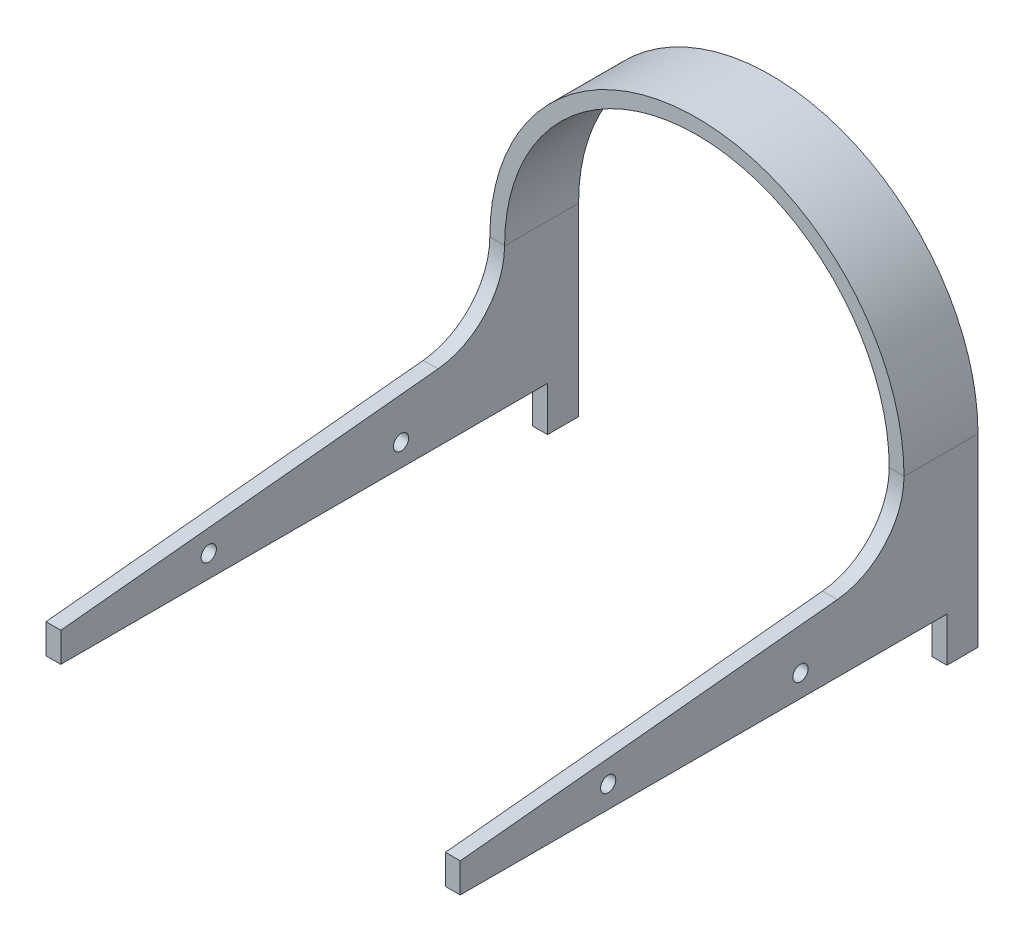
ISO-10303-21;
HEADER;
FILE_DESCRIPTION(('STEP AP214'),'2;1');
FILE_NAME('part.step','',(''),(''),'','','');
FILE_SCHEMA(('AUTOMOTIVE_DESIGN { 1 0 10303 214 1 1 1 1 }'));
ENDSEC;
DATA;
#1=APPLICATION_CONTEXT('core data for automotive mechanical design processes');
#2=APPLICATION_PROTOCOL_DEFINITION('international standard','automotive_design',2000,#1);
#3=PRODUCT_CONTEXT('',#1,'mechanical');
#4=PRODUCT('Part','Part','',(#3));
#5=PRODUCT_RELATED_PRODUCT_CATEGORY('part','',(#4));
#6=PRODUCT_DEFINITION_FORMATION('','',#4);
#7=PRODUCT_DEFINITION_CONTEXT('part definition',#1,'design');
#8=PRODUCT_DEFINITION('design','',#6,#7);
#9=PRODUCT_DEFINITION_SHAPE('','',#8);
#10=(LENGTH_UNIT() NAMED_UNIT(*) SI_UNIT(.MILLI.,.METRE.));
#11=(NAMED_UNIT(*) PLANE_ANGLE_UNIT() SI_UNIT($,.RADIAN.));
#12=(NAMED_UNIT(*) SI_UNIT($,.STERADIAN.) SOLID_ANGLE_UNIT());
#13=UNCERTAINTY_MEASURE_WITH_UNIT(LENGTH_MEASURE(1.E-05),#10,'distance_accuracy_value','');
#14=(GEOMETRIC_REPRESENTATION_CONTEXT(3) GLOBAL_UNCERTAINTY_ASSIGNED_CONTEXT((#13)) GLOBAL_UNIT_ASSIGNED_CONTEXT((#10,
#11,#12)) REPRESENTATION_CONTEXT('',''));
#15=CARTESIAN_POINT('',(0.,0.,0.));
#16=DIRECTION('',(0.,0.,1.));
#17=DIRECTION('',(1.,0.,0.));
#18=AXIS2_PLACEMENT_3D('',#15,#16,#17);
#19=CARTESIAN_POINT('',(0.,0.,350.));
#20=DIRECTION('',(0.,0.,1.));
#21=DIRECTION('',(1.,0.,0.));
#22=AXIS2_PLACEMENT_3D('',#19,#20,#21);
#23=PLANE('',#22);
#24=DIRECTION('',(1.,0.,0.));
#25=VECTOR('',#24,1.);
#26=CARTESIAN_POINT('',(0.,-75.,350.));
#27=LINE('',#26,#25);
#28=CARTESIAN_POINT('',(-140.,-75.,350.));
#29=VERTEX_POINT('',#28);
#30=CARTESIAN_POINT('',(-130.,-75.,350.));
#31=VERTEX_POINT('',#30);
#32=EDGE_CURVE('E44',#29,#31,#27,.T.);
#33=ORIENTED_EDGE('',*,*,#32,.F.);
#34=DIRECTION('',(0.,-1.,0.));
#35=VECTOR('',#34,1.);
#36=CARTESIAN_POINT('',(-140.,0.,350.));
#37=LINE('',#36,#35);
#38=CARTESIAN_POINT('',(-140.,-95.,350.));
#39=VERTEX_POINT('',#38);
#40=EDGE_CURVE('E282',#29,#39,#37,.T.);
#41=ORIENTED_EDGE('',*,*,#40,.T.);
#42=DIRECTION('',(-1.,0.,0.));
#43=VECTOR('',#42,1.);
#44=CARTESIAN_POINT('',(0.,-95.,350.));
#45=LINE('',#44,#43);
#46=CARTESIAN_POINT('',(-130.,-95.,350.));
#47=VERTEX_POINT('',#46);
#48=EDGE_CURVE('E328',#47,#39,#45,.T.);
#49=ORIENTED_EDGE('',*,*,#48,.F.);
#50=DIRECTION('',(0.,1.,0.));
#51=VECTOR('',#50,1.);
#52=CARTESIAN_POINT('',(-130.,-125.,350.));
#53=LINE('',#52,#51);
#54=EDGE_CURVE('E284',#47,#31,#53,.T.);
#55=ORIENTED_EDGE('',*,*,#54,.T.);
#56=EDGE_LOOP('',(#33,#41,#49,#55));
#57=FACE_BOUND('',#56,.T.);
#58=ADVANCED_FACE('F35',(#57),#23,.T.);
#59=CARTESIAN_POINT('',(0.,0.,350.));
#60=DIRECTION('',(0.,0.,-1.));
#61=DIRECTION('',(-1.,0.,0.));
#62=AXIS2_PLACEMENT_3D('',#59,#60,#61);
#63=CYLINDRICAL_SURFACE('',#62,140.);
#64=DIRECTION('',(0.,0.,-1.));
#65=VECTOR('',#64,1.);
#66=CARTESIAN_POINT('',(-140.,0.,350.));
#67=LINE('',#66,#65);
#68=CARTESIAN_POINT('',(-140.,0.,50.0006218982631));
#69=VERTEX_POINT('',#68);
#70=CARTESIAN_POINT('',(-140.,0.,0.));
#71=VERTEX_POINT('',#70);
#72=EDGE_CURVE('E326',#69,#71,#67,.T.);
#73=ORIENTED_EDGE('',*,*,#72,.F.);
#74=CARTESIAN_POINT('',(-140.,0.,50.0006218982631));
#75=CARTESIAN_POINT('',(-140.000000000223,0.0415627920890886,50.000414598921));
#76=CARTESIAN_POINT('',(-139.999981491558,0.0831256969340281,50.0002591243947));
#77=CARTESIAN_POINT('',(-139.999907456452,0.166251732135609,50.0000518249737));
#78=CARTESIAN_POINT('',(-139.999851930011,0.207814862492251,50.000000000079));
#79=CARTESIAN_POINT('',(-139.999777894683,0.249378105604743,50.));
#80=B_SPLINE_CURVE_WITH_KNOTS('',3,(#74,#75,#76,#77,#78,#79),.UNSPECIFIED.,.F.,.F.,(4,2,4),(0.,
0.124689599271297,0.249379198542594),.UNSPECIFIED.);
#81=CARTESIAN_POINT('',(-139.999777894683,0.249378105604721,50.));
#82=VERTEX_POINT('',#81);
#83=EDGE_CURVE('E241',#69,#82,#80,.T.);
#84=ORIENTED_EDGE('',*,*,#83,.T.);
#85=CARTESIAN_POINT('',(0.,0.,50.));
#86=DIRECTION('',(0.,0.,-1.));
#87=DIRECTION('',(0.,1.,0.));
#88=AXIS2_PLACEMENT_3D('',#85,#86,#87);
#89=CIRCLE('',#88,140.);
#90=CARTESIAN_POINT('',(139.999777894683,0.249378105604846,50.));
#91=VERTEX_POINT('',#90);
#92=EDGE_CURVE('E248',#82,#91,#89,.T.);
#93=ORIENTED_EDGE('',*,*,#92,.T.);
#94=CARTESIAN_POINT('',(139.999777894683,0.249378105604867,50.));
#95=CARTESIAN_POINT('',(139.999851930011,0.207814862492357,50.000000000079));
#96=CARTESIAN_POINT('',(139.999907456452,0.166251732135698,50.0000518249737));
#97=CARTESIAN_POINT('',(139.999981491558,0.083125696934081,50.0002591243947));
#98=CARTESIAN_POINT('',(140.000000000223,0.0415627920891236,50.000414598921));
#99=CARTESIAN_POINT('',(140.,0.,50.0006218982631));
#100=B_SPLINE_CURVE_WITH_KNOTS('',3,(#94,#95,#96,#97,#98,#99),.UNSPECIFIED.,.F.,.F.,(4,2,4),(0.,
0.12468959927135,0.249379198542701),.UNSPECIFIED.);
#101=CARTESIAN_POINT('',(140.,0.,50.0006218982631));
#102=VERTEX_POINT('',#101);
#103=EDGE_CURVE('E237',#91,#102,#100,.T.);
#104=ORIENTED_EDGE('',*,*,#103,.T.);
#105=DIRECTION('',(0.,0.,-1.));
#106=VECTOR('',#105,1.);
#107=CARTESIAN_POINT('',(140.,0.,350.));
#108=LINE('',#107,#106);
#109=CARTESIAN_POINT('',(140.,0.,0.));
#110=VERTEX_POINT('',#109);
#111=EDGE_CURVE('E185',#102,#110,#108,.T.);
#112=ORIENTED_EDGE('',*,*,#111,.T.);
#113=CARTESIAN_POINT('',(0.,0.,0.));
#114=DIRECTION('',(0.,0.,1.));
#115=DIRECTION('',(1.,0.,0.));
#116=AXIS2_PLACEMENT_3D('',#113,#114,#115);
#117=CIRCLE('',#116,140.);
#118=EDGE_CURVE('E281',#110,#71,#117,.T.);
#119=ORIENTED_EDGE('',*,*,#118,.T.);
#120=EDGE_LOOP('',(#73,#84,#93,#104,#112,#119));
#121=FACE_BOUND('',#120,.T.);
#122=ADVANCED_FACE('F37',(#121),#63,.T.);
#123=CARTESIAN_POINT('',(-140.,0.,350.));
#124=DIRECTION('',(1.,0.,0.));
#125=DIRECTION('',(0.,1.,0.));
#126=AXIS2_PLACEMENT_3D('',#123,#124,#125);
#127=PLANE('',#126);
#128=CARTESIAN_POINT('',(-140.,-80.,250.));
#129=DIRECTION('',(-1.,0.,0.));
#130=DIRECTION('',(0.,-1.,0.));
#131=AXIS2_PLACEMENT_3D('',#128,#129,#130);
#132=CIRCLE('',#131,5.15000000000004);
#133=CARTESIAN_POINT('',(-140.,-85.1500000000001,250.));
#134=VERTEX_POINT('',#133);
#135=EDGE_CURVE('E439',#134,#134,#132,.T.);
#136=ORIENTED_EDGE('',*,*,#135,.F.);
#137=EDGE_LOOP('',(#136));
#138=FACE_BOUND('',#137,.T.);
#139=CARTESIAN_POINT('',(-140.,-80.,120.));
#140=DIRECTION('',(-1.,0.,0.));
#141=DIRECTION('',(0.,-1.,0.));
#142=AXIS2_PLACEMENT_3D('',#139,#140,#141);
#143=CIRCLE('',#142,5.14999999999998);
#144=CARTESIAN_POINT('',(-140.,-85.15,120.));
#145=VERTEX_POINT('',#144);
#146=EDGE_CURVE('E429',#145,#145,#143,.T.);
#147=ORIENTED_EDGE('',*,*,#146,.F.);
#148=EDGE_LOOP('',(#147));
#149=FACE_BOUND('',#148,.T.);
#150=ORIENTED_EDGE('',*,*,#40,.F.);
#151=DIRECTION('',(0.,-0.0995037190209989,0.995037190209989));
#152=VECTOR('',#151,1.);
#153=CARTESIAN_POINT('',(-140.,-49.5024814048951,95.0248140489504));
#154=LINE('',#153,#152);
#155=CARTESIAN_POINT('',(-140.,-49.5024814048951,95.0248140489504));
#156=VERTEX_POINT('',#155);
#157=EDGE_CURVE('E186',#156,#29,#154,.T.);
#158=ORIENTED_EDGE('',*,*,#157,.F.);
#159=CARTESIAN_POINT('',(-140.,0.249378105604423,100.));
#160=DIRECTION('',(-1.,0.,0.));
#161=DIRECTION('',(0.,-1.,0.));
#162=AXIS2_PLACEMENT_3D('',#159,#160,#161);
#163=CIRCLE('',#162,50.);
#164=EDGE_CURVE('E188',#69,#156,#163,.T.);
#165=ORIENTED_EDGE('',*,*,#164,.F.);
#166=ORIENTED_EDGE('',*,*,#72,.T.);
#167=DIRECTION('',(0.,-1.,0.));
#168=VECTOR('',#167,1.);
#169=CARTESIAN_POINT('',(-140.,0.,0.));
#170=LINE('',#169,#168);
#171=CARTESIAN_POINT('',(-140.,-125.,0.));
#172=VERTEX_POINT('',#171);
#173=EDGE_CURVE('E294',#71,#172,#170,.T.);
#174=ORIENTED_EDGE('',*,*,#173,.T.);
#175=DIRECTION('',(0.,0.,-1.));
#176=VECTOR('',#175,1.);
#177=CARTESIAN_POINT('',(-140.,-125.,350.));
#178=LINE('',#177,#176);
#179=CARTESIAN_POINT('',(-140.,-125.,21.));
#180=VERTEX_POINT('',#179);
#181=EDGE_CURVE('E324',#180,#172,#178,.T.);
#182=ORIENTED_EDGE('',*,*,#181,.F.);
#183=DIRECTION('',(0.,-1.,0.));
#184=VECTOR('',#183,1.);
#185=CARTESIAN_POINT('',(-140.,-125.,21.));
#186=LINE('',#185,#184);
#187=CARTESIAN_POINT('',(-140.,-95.0000000000001,21.));
#188=VERTEX_POINT('',#187);
#189=EDGE_CURVE('E253',#188,#180,#186,.T.);
#190=ORIENTED_EDGE('',*,*,#189,.F.);
#191=DIRECTION('',(0.,0.,-1.));
#192=VECTOR('',#191,1.);
#193=CARTESIAN_POINT('',(-140.,-95.,350.));
#194=LINE('',#193,#192);
#195=EDGE_CURVE('E250',#39,#188,#194,.T.);
#196=ORIENTED_EDGE('',*,*,#195,.F.);
#197=EDGE_LOOP('',(#150,#158,#165,#166,#174,#182,#190,#196));
#198=FACE_BOUND('',#197,.T.);
#199=ADVANCED_FACE('F348',(#138,#149,#198),#127,.F.);
#200=CARTESIAN_POINT('',(-140.,-125.,350.));
#201=DIRECTION('',(0.,1.,0.));
#202=DIRECTION('',(0.,0.,1.));
#203=AXIS2_PLACEMENT_3D('',#200,#201,#202);
#204=PLANE('',#203);
#205=DIRECTION('',(0.,0.,-1.));
#206=VECTOR('',#205,1.);
#207=CARTESIAN_POINT('',(-130.,-125.,350.));
#208=LINE('',#207,#206);
#209=CARTESIAN_POINT('',(-130.,-125.,21.));
#210=VERTEX_POINT('',#209);
#211=CARTESIAN_POINT('',(-130.,-125.,0.));
#212=VERTEX_POINT('',#211);
#213=EDGE_CURVE('E322',#210,#212,#208,.T.);
#214=ORIENTED_EDGE('',*,*,#213,.F.);
#215=DIRECTION('',(-1.,0.,0.));
#216=VECTOR('',#215,1.);
#217=CARTESIAN_POINT('',(140.,-125.,21.));
#218=LINE('',#217,#216);
#219=EDGE_CURVE('E264',#210,#180,#218,.T.);
#220=ORIENTED_EDGE('',*,*,#219,.T.);
#221=ORIENTED_EDGE('',*,*,#181,.T.);
#222=DIRECTION('',(1.,0.,0.));
#223=VECTOR('',#222,1.);
#224=CARTESIAN_POINT('',(-140.,-125.,0.));
#225=LINE('',#224,#223);
#226=EDGE_CURVE('E297',#172,#212,#225,.T.);
#227=ORIENTED_EDGE('',*,*,#226,.T.);
#228=EDGE_LOOP('',(#214,#220,#221,#227));
#229=FACE_BOUND('',#228,.T.);
#230=ADVANCED_FACE('F355',(#229),#204,.F.);
#231=CARTESIAN_POINT('',(-130.,-125.,350.));
#232=DIRECTION('',(-1.,0.,0.));
#233=DIRECTION('',(0.,0.,1.));
#234=AXIS2_PLACEMENT_3D('',#231,#232,#233);
#235=PLANE('',#234);
#236=CARTESIAN_POINT('',(-130.,-80.,250.));
#237=DIRECTION('',(-1.,0.,0.));
#238=DIRECTION('',(0.,0.,1.));
#239=AXIS2_PLACEMENT_3D('',#236,#237,#238);
#240=CIRCLE('',#239,5.15000000000004);
#241=CARTESIAN_POINT('',(-130.,-80.,255.15));
#242=VERTEX_POINT('',#241);
#243=EDGE_CURVE('E433',#242,#242,#240,.T.);
#244=ORIENTED_EDGE('',*,*,#243,.T.);
#245=EDGE_LOOP('',(#244));
#246=FACE_BOUND('',#245,.T.);
#247=CARTESIAN_POINT('',(-130.,-80.,120.));
#248=DIRECTION('',(-1.,0.,0.));
#249=DIRECTION('',(0.,0.,1.));
#250=AXIS2_PLACEMENT_3D('',#247,#248,#249);
#251=CIRCLE('',#250,5.14999999999998);
#252=CARTESIAN_POINT('',(-130.,-80.,125.15));
#253=VERTEX_POINT('',#252);
#254=EDGE_CURVE('E191',#253,#253,#251,.T.);
#255=ORIENTED_EDGE('',*,*,#254,.T.);
#256=EDGE_LOOP('',(#255));
#257=FACE_BOUND('',#256,.T.);
#258=CARTESIAN_POINT('',(-130.,0.249378105604427,100.));
#259=DIRECTION('',(-1.,0.,0.));
#260=DIRECTION('',(0.,0.,1.));
#261=AXIS2_PLACEMENT_3D('',#258,#259,#260);
#262=CIRCLE('',#261,50.);
#263=CARTESIAN_POINT('',(-130.,0.,50.0006218982631));
#264=VERTEX_POINT('',#263);
#265=CARTESIAN_POINT('',(-130.,-49.502481404895,95.0248140489504));
#266=VERTEX_POINT('',#265);
#267=EDGE_CURVE('E242',#264,#266,#262,.T.);
#268=ORIENTED_EDGE('',*,*,#267,.T.);
#269=DIRECTION('',(0.,-0.0995037190209989,0.995037190209989));
#270=VECTOR('',#269,1.);
#271=CARTESIAN_POINT('',(-130.,-75.4950495049505,354.950495049505));
#272=LINE('',#271,#270);
#273=EDGE_CURVE('E201',#266,#31,#272,.T.);
#274=ORIENTED_EDGE('',*,*,#273,.T.);
#275=ORIENTED_EDGE('',*,*,#54,.F.);
#276=DIRECTION('',(0.,0.,-1.));
#277=VECTOR('',#276,1.);
#278=CARTESIAN_POINT('',(-130.,-95.,350.));
#279=LINE('',#278,#277);
#280=CARTESIAN_POINT('',(-130.,-95.0000000000001,21.));
#281=VERTEX_POINT('',#280);
#282=EDGE_CURVE('E272',#47,#281,#279,.T.);
#283=ORIENTED_EDGE('',*,*,#282,.T.);
#284=DIRECTION('',(0.,-1.,0.));
#285=VECTOR('',#284,1.);
#286=CARTESIAN_POINT('',(-130.,-125.,21.));
#287=LINE('',#286,#285);
#288=EDGE_CURVE('E278',#281,#210,#287,.T.);
#289=ORIENTED_EDGE('',*,*,#288,.T.);
#290=ORIENTED_EDGE('',*,*,#213,.T.);
#291=DIRECTION('',(0.,1.,0.));
#292=VECTOR('',#291,1.);
#293=CARTESIAN_POINT('',(-130.,-125.,0.));
#294=LINE('',#293,#292);
#295=CARTESIAN_POINT('',(-130.,0.,0.));
#296=VERTEX_POINT('',#295);
#297=EDGE_CURVE('E300',#212,#296,#294,.T.);
#298=ORIENTED_EDGE('',*,*,#297,.T.);
#299=DIRECTION('',(0.,0.,-1.));
#300=VECTOR('',#299,1.);
#301=CARTESIAN_POINT('',(-130.,0.,350.));
#302=LINE('',#301,#300);
#303=EDGE_CURVE('E320',#264,#296,#302,.T.);
#304=ORIENTED_EDGE('',*,*,#303,.F.);
#305=EDGE_LOOP('',(#268,#274,#275,#283,#289,#290,#298,#304));
#306=FACE_BOUND('',#305,.T.);
#307=ADVANCED_FACE('F339',(#246,#257,#306),#235,.F.);
#308=CARTESIAN_POINT('',(0.,0.,350.));
#309=DIRECTION('',(0.,0.,-1.));
#310=DIRECTION('',(-1.,0.,0.));
#311=AXIS2_PLACEMENT_3D('',#308,#309,#310);
#312=CYLINDRICAL_SURFACE('',#311,130.);
#313=DIRECTION('',(0.,0.,-1.));
#314=VECTOR('',#313,1.);
#315=CARTESIAN_POINT('',(130.,0.,350.));
#316=LINE('',#315,#314);
#317=CARTESIAN_POINT('',(130.,0.,50.0006218982631));
#318=VERTEX_POINT('',#317);
#319=CARTESIAN_POINT('',(130.,0.,0.));
#320=VERTEX_POINT('',#319);
#321=EDGE_CURVE('E318',#318,#320,#316,.T.);
#322=ORIENTED_EDGE('',*,*,#321,.F.);
#323=CARTESIAN_POINT('',(130.,0.,50.0006218982631));
#324=CARTESIAN_POINT('',(130.000000000239,0.041562797356397,50.0004145989079));
#325=CARTESIAN_POINT('',(129.999980067827,0.0831257048349915,50.000259124375));
#326=CARTESIAN_POINT('',(129.999900337703,0.166251740036607,50.000051824954));
#327=CARTESIAN_POINT('',(129.999840539991,0.207814867759628,50.0000000000658));
#328=CARTESIAN_POINT('',(129.999760809628,0.249378105604863,50.));
#329=B_SPLINE_CURVE_WITH_KNOTS('',3,(#323,#324,#325,#326,#327,#328),.UNSPECIFIED.,.F.,.F.,(4,2,
4),(0.,0.124689609147477,0.249379218294954),.UNSPECIFIED.);
#330=CARTESIAN_POINT('',(129.999760809628,0.249378105604841,50.));
#331=VERTEX_POINT('',#330);
#332=EDGE_CURVE('E205',#318,#331,#329,.T.);
#333=ORIENTED_EDGE('',*,*,#332,.T.);
#334=CARTESIAN_POINT('',(0.,0.,50.));
#335=DIRECTION('',(0.,0.,-1.));
#336=DIRECTION('',(0.,1.,0.));
#337=AXIS2_PLACEMENT_3D('',#334,#335,#336);
#338=CIRCLE('',#337,130.);
#339=CARTESIAN_POINT('',(-129.999760809628,0.249378105604726,50.));
#340=VERTEX_POINT('',#339);
#341=EDGE_CURVE('E11',#331,#340,#338,.F.);
#342=ORIENTED_EDGE('',*,*,#341,.T.);
#343=CARTESIAN_POINT('',(-129.999760809628,0.249378105604747,50.));
#344=CARTESIAN_POINT('',(-129.999840539991,0.207814867759529,50.0000000000658));
#345=CARTESIAN_POINT('',(-129.999900337703,0.166251740036525,50.000051824954));
#346=CARTESIAN_POINT('',(-129.999980067827,0.0831257048349424,50.000259124375));
#347=CARTESIAN_POINT('',(-130.000000000239,0.0415627973563645,50.0004145989079));
#348=CARTESIAN_POINT('',(-130.,0.,50.0006218982631));
#349=B_SPLINE_CURVE_WITH_KNOTS('',3,(#343,#344,#345,#346,#347,#348),.UNSPECIFIED.,.F.,.F.,(4,2,
4),(0.,0.124689609147427,0.249379218294854),.UNSPECIFIED.);
#350=EDGE_CURVE('E213',#340,#264,#349,.T.);
#351=ORIENTED_EDGE('',*,*,#350,.T.);
#352=ORIENTED_EDGE('',*,*,#303,.T.);
#353=CARTESIAN_POINT('',(0.,0.,0.));
#354=DIRECTION('',(0.,0.,-1.));
#355=DIRECTION('',(1.,0.,0.));
#356=AXIS2_PLACEMENT_3D('',#353,#354,#355);
#357=CIRCLE('',#356,130.);
#358=EDGE_CURVE('E303',#296,#320,#357,.T.);
#359=ORIENTED_EDGE('',*,*,#358,.T.);
#360=EDGE_LOOP('',(#322,#333,#342,#351,#352,#359));
#361=FACE_BOUND('',#360,.T.);
#362=ADVANCED_FACE('F218',(#361),#312,.F.);
#363=CARTESIAN_POINT('',(130.,-125.,350.));
#364=DIRECTION('',(1.,0.,0.));
#365=DIRECTION('',(0.,0.,-1.));
#366=AXIS2_PLACEMENT_3D('',#363,#364,#365);
#367=PLANE('',#366);
#368=CARTESIAN_POINT('',(130.,-79.9999999999999,250.));
#369=DIRECTION('',(1.,0.,0.));
#370=DIRECTION('',(0.,0.,-1.));
#371=AXIS2_PLACEMENT_3D('',#368,#369,#370);
#372=CIRCLE('',#371,5.15000000000004);
#373=CARTESIAN_POINT('',(130.,-79.9999999999999,244.85));
#374=VERTEX_POINT('',#373);
#375=EDGE_CURVE('E421',#374,#374,#372,.T.);
#376=ORIENTED_EDGE('',*,*,#375,.T.);
#377=EDGE_LOOP('',(#376));
#378=FACE_BOUND('',#377,.T.);
#379=CARTESIAN_POINT('',(130.,-79.9999999999999,120.));
#380=DIRECTION('',(1.,0.,0.));
#381=DIRECTION('',(0.,0.,-1.));
#382=AXIS2_PLACEMENT_3D('',#379,#380,#381);
#383=CIRCLE('',#382,5.14999999999998);
#384=CARTESIAN_POINT('',(130.,-79.9999999999999,114.85));
#385=VERTEX_POINT('',#384);
#386=EDGE_CURVE('E424',#385,#385,#383,.T.);
#387=ORIENTED_EDGE('',*,*,#386,.T.);
#388=EDGE_LOOP('',(#387));
#389=FACE_BOUND('',#388,.T.);
#390=DIRECTION('',(0.,-1.,0.));
#391=VECTOR('',#390,1.);
#392=CARTESIAN_POINT('',(130.,-125.,350.));
#393=LINE('',#392,#391);
#394=CARTESIAN_POINT('',(130.,-75.,350.));
#395=VERTEX_POINT('',#394);
#396=CARTESIAN_POINT('',(130.,-94.9999999999999,350.));
#397=VERTEX_POINT('',#396);
#398=EDGE_CURVE('E288',#395,#397,#393,.T.);
#399=ORIENTED_EDGE('',*,*,#398,.F.);
#400=DIRECTION('',(0.,0.0995037190209989,-0.995037190209989));
#401=VECTOR('',#400,1.);
#402=CARTESIAN_POINT('',(130.,-75.4950495049504,354.950495049505));
#403=LINE('',#402,#401);
#404=CARTESIAN_POINT('',(130.,-49.5024814048949,95.0248140489504));
#405=VERTEX_POINT('',#404);
#406=EDGE_CURVE('E51',#395,#405,#403,.T.);
#407=ORIENTED_EDGE('',*,*,#406,.T.);
#408=CARTESIAN_POINT('',(130.,0.249378105604543,100.));
#409=DIRECTION('',(1.,0.,0.));
#410=DIRECTION('',(0.,0.,-1.));
#411=AXIS2_PLACEMENT_3D('',#408,#409,#410);
#412=CIRCLE('',#411,50.);
#413=EDGE_CURVE('E170',#405,#318,#412,.T.);
#414=ORIENTED_EDGE('',*,*,#413,.T.);
#415=ORIENTED_EDGE('',*,*,#321,.T.);
#416=DIRECTION('',(0.,-1.,0.));
#417=VECTOR('',#416,1.);
#418=CARTESIAN_POINT('',(130.,-125.,0.));
#419=LINE('',#418,#417);
#420=CARTESIAN_POINT('',(130.,-125.,0.));
#421=VERTEX_POINT('',#420);
#422=EDGE_CURVE('E306',#320,#421,#419,.T.);
#423=ORIENTED_EDGE('',*,*,#422,.T.);
#424=DIRECTION('',(0.,0.,-1.));
#425=VECTOR('',#424,1.);
#426=CARTESIAN_POINT('',(130.,-125.,350.));
#427=LINE('',#426,#425);
#428=CARTESIAN_POINT('',(130.,-125.,21.));
#429=VERTEX_POINT('',#428);
#430=EDGE_CURVE('E316',#429,#421,#427,.T.);
#431=ORIENTED_EDGE('',*,*,#430,.F.);
#432=DIRECTION('',(0.,1.,0.));
#433=VECTOR('',#432,1.);
#434=CARTESIAN_POINT('',(130.,-125.,21.));
#435=LINE('',#434,#433);
#436=CARTESIAN_POINT('',(130.,-94.9999999999999,21.));
#437=VERTEX_POINT('',#436);
#438=EDGE_CURVE('E275',#429,#437,#435,.T.);
#439=ORIENTED_EDGE('',*,*,#438,.T.);
#440=DIRECTION('',(0.,0.,1.));
#441=VECTOR('',#440,1.);
#442=CARTESIAN_POINT('',(130.,-94.9999999999999,350.));
#443=LINE('',#442,#441);
#444=EDGE_CURVE('E263',#437,#397,#443,.T.);
#445=ORIENTED_EDGE('',*,*,#444,.T.);
#446=EDGE_LOOP('',(#399,#407,#414,#415,#423,#431,#439,#445));
#447=FACE_BOUND('',#446,.T.);
#448=ADVANCED_FACE('F382',(#378,#389,#447),#367,.F.);
#449=CARTESIAN_POINT('',(140.,-125.,350.));
#450=DIRECTION('',(0.,1.,0.));
#451=DIRECTION('',(0.,0.,1.));
#452=AXIS2_PLACEMENT_3D('',#449,#450,#451);
#453=PLANE('',#452);
#454=DIRECTION('',(0.,0.,-1.));
#455=VECTOR('',#454,1.);
#456=CARTESIAN_POINT('',(140.,-125.,350.));
#457=LINE('',#456,#455);
#458=CARTESIAN_POINT('',(140.,-125.,21.));
#459=VERTEX_POINT('',#458);
#460=CARTESIAN_POINT('',(140.,-125.,0.));
#461=VERTEX_POINT('',#460);
#462=EDGE_CURVE('E314',#459,#461,#457,.T.);
#463=ORIENTED_EDGE('',*,*,#462,.F.);
#464=EDGE_CURVE('E260',#459,#429,#218,.T.);
#465=ORIENTED_EDGE('',*,*,#464,.T.);
#466=ORIENTED_EDGE('',*,*,#430,.T.);
#467=DIRECTION('',(1.,0.,0.));
#468=VECTOR('',#467,1.);
#469=CARTESIAN_POINT('',(140.,-125.,0.));
#470=LINE('',#469,#468);
#471=EDGE_CURVE('E309',#421,#461,#470,.T.);
#472=ORIENTED_EDGE('',*,*,#471,.T.);
#473=EDGE_LOOP('',(#463,#465,#466,#472));
#474=FACE_BOUND('',#473,.T.);
#475=ADVANCED_FACE('F378',(#474),#453,.F.);
#476=CARTESIAN_POINT('',(140.,0.,350.));
#477=DIRECTION('',(-1.,0.,0.));
#478=DIRECTION('',(0.,-1.,0.));
#479=AXIS2_PLACEMENT_3D('',#476,#477,#478);
#480=PLANE('',#479);
#481=CARTESIAN_POINT('',(140.,-79.9999999999999,250.));
#482=DIRECTION('',(-1.,0.,0.));
#483=DIRECTION('',(0.,-1.,0.));
#484=AXIS2_PLACEMENT_3D('',#481,#482,#483);
#485=CIRCLE('',#484,5.15000000000004);
#486=CARTESIAN_POINT('',(140.,-85.1499999999999,250.));
#487=VERTEX_POINT('',#486);
#488=EDGE_CURVE('E438',#487,#487,#485,.T.);
#489=ORIENTED_EDGE('',*,*,#488,.T.);
#490=EDGE_LOOP('',(#489));
#491=FACE_BOUND('',#490,.T.);
#492=CARTESIAN_POINT('',(140.,-79.9999999999999,120.));
#493=DIRECTION('',(-1.,0.,0.));
#494=DIRECTION('',(0.,-1.,0.));
#495=AXIS2_PLACEMENT_3D('',#492,#493,#494);
#496=CIRCLE('',#495,5.14999999999998);
#497=CARTESIAN_POINT('',(140.,-85.1499999999999,120.));
#498=VERTEX_POINT('',#497);
#499=EDGE_CURVE('E426',#498,#498,#496,.T.);
#500=ORIENTED_EDGE('',*,*,#499,.T.);
#501=EDGE_LOOP('',(#500));
#502=FACE_BOUND('',#501,.T.);
#503=CARTESIAN_POINT('',(140.,0.249378105604547,100.));
#504=DIRECTION('',(-1.,0.,0.));
#505=DIRECTION('',(0.,-1.,0.));
#506=AXIS2_PLACEMENT_3D('',#503,#504,#505);
#507=CIRCLE('',#506,50.);
#508=CARTESIAN_POINT('',(140.,-49.5024814048949,95.0248140489504));
#509=VERTEX_POINT('',#508);
#510=EDGE_CURVE('E167',#102,#509,#507,.T.);
#511=ORIENTED_EDGE('',*,*,#510,.T.);
#512=DIRECTION('',(0.,-0.0995037190209989,0.995037190209989));
#513=VECTOR('',#512,1.);
#514=CARTESIAN_POINT('',(140.,-49.5024814048949,95.0248140489504));
#515=LINE('',#514,#513);
#516=CARTESIAN_POINT('',(140.,-74.9999999999999,350.));
#517=VERTEX_POINT('',#516);
#518=EDGE_CURVE('E175',#509,#517,#515,.T.);
#519=ORIENTED_EDGE('',*,*,#518,.T.);
#520=DIRECTION('',(0.,1.,0.));
#521=VECTOR('',#520,1.);
#522=CARTESIAN_POINT('',(140.,0.,350.));
#523=LINE('',#522,#521);
#524=CARTESIAN_POINT('',(140.,-94.9999999999999,350.));
#525=VERTEX_POINT('',#524);
#526=EDGE_CURVE('E290',#525,#517,#523,.T.);
#527=ORIENTED_EDGE('',*,*,#526,.F.);
#528=DIRECTION('',(0.,0.,-1.));
#529=VECTOR('',#528,1.);
#530=CARTESIAN_POINT('',(140.,-94.9999999999999,350.));
#531=LINE('',#530,#529);
#532=CARTESIAN_POINT('',(140.,-94.9999999999999,21.));
#533=VERTEX_POINT('',#532);
#534=EDGE_CURVE('E59',#525,#533,#531,.T.);
#535=ORIENTED_EDGE('',*,*,#534,.T.);
#536=DIRECTION('',(0.,-1.,0.));
#537=VECTOR('',#536,1.);
#538=CARTESIAN_POINT('',(140.,-125.,21.));
#539=LINE('',#538,#537);
#540=EDGE_CURVE('E252',#533,#459,#539,.T.);
#541=ORIENTED_EDGE('',*,*,#540,.T.);
#542=ORIENTED_EDGE('',*,*,#462,.T.);
#543=DIRECTION('',(0.,1.,0.));
#544=VECTOR('',#543,1.);
#545=CARTESIAN_POINT('',(140.,0.,0.));
#546=LINE('',#545,#544);
#547=EDGE_CURVE('E285',#461,#110,#546,.T.);
#548=ORIENTED_EDGE('',*,*,#547,.T.);
#549=ORIENTED_EDGE('',*,*,#111,.F.);
#550=EDGE_LOOP('',(#511,#519,#527,#535,#541,#542,#548,#549));
#551=FACE_BOUND('',#550,.T.);
#552=ADVANCED_FACE('F183',(#491,#502,#551),#480,.F.);
#553=DIRECTION('',(-1.,0.,0.));
#554=VECTOR('',#553,1.);
#555=CARTESIAN_POINT('',(140.,-74.9999999999999,350.));
#556=LINE('',#555,#554);
#557=EDGE_CURVE('E171',#517,#395,#556,.T.);
#558=ORIENTED_EDGE('',*,*,#557,.T.);
#559=ORIENTED_EDGE('',*,*,#398,.T.);
#560=DIRECTION('',(-1.,0.,0.));
#561=VECTOR('',#560,1.);
#562=CARTESIAN_POINT('',(140.,-94.9999999999999,350.));
#563=LINE('',#562,#561);
#564=EDGE_CURVE('E256',#525,#397,#563,.T.);
#565=ORIENTED_EDGE('',*,*,#564,.F.);
#566=ORIENTED_EDGE('',*,*,#526,.T.);
#567=EDGE_LOOP('',(#558,#559,#565,#566));
#568=FACE_BOUND('',#567,.T.);
#569=ADVANCED_FACE('F384',(#568),#23,.T.);
#570=CARTESIAN_POINT('',(0.,0.,0.));
#571=DIRECTION('',(0.,0.,1.));
#572=DIRECTION('',(1.,0.,0.));
#573=AXIS2_PLACEMENT_3D('',#570,#571,#572);
#574=PLANE('',#573);
#575=ORIENTED_EDGE('',*,*,#118,.F.);
#576=ORIENTED_EDGE('',*,*,#547,.F.);
#577=ORIENTED_EDGE('',*,*,#471,.F.);
#578=ORIENTED_EDGE('',*,*,#422,.F.);
#579=ORIENTED_EDGE('',*,*,#358,.F.);
#580=ORIENTED_EDGE('',*,*,#297,.F.);
#581=ORIENTED_EDGE('',*,*,#226,.F.);
#582=ORIENTED_EDGE('',*,*,#173,.F.);
#583=EDGE_LOOP('',(#575,#576,#577,#578,#579,#580,#581,#582));
#584=FACE_BOUND('',#583,.T.);
#585=ADVANCED_FACE('F362',(#584),#574,.F.);
#586=CARTESIAN_POINT('',(140.,-94.9999999999999,350.));
#587=DIRECTION('',(0.,1.,0.));
#588=DIRECTION('',(-1.,0.,0.));
#589=AXIS2_PLACEMENT_3D('',#586,#587,#588);
#590=PLANE('',#589);
#591=ORIENTED_EDGE('',*,*,#48,.T.);
#592=ORIENTED_EDGE('',*,*,#195,.T.);
#593=DIRECTION('',(-1.,0.,0.));
#594=VECTOR('',#593,1.);
#595=CARTESIAN_POINT('',(140.,-94.9999999999999,21.));
#596=LINE('',#595,#594);
#597=EDGE_CURVE('E268',#281,#188,#596,.T.);
#598=ORIENTED_EDGE('',*,*,#597,.F.);
#599=ORIENTED_EDGE('',*,*,#282,.F.);
#600=EDGE_LOOP('',(#591,#592,#598,#599));
#601=FACE_BOUND('',#600,.T.);
#602=ADVANCED_FACE('F344',(#601),#590,.F.);
#603=CARTESIAN_POINT('',(140.,-125.,21.));
#604=DIRECTION('',(0.,0.,-1.));
#605=DIRECTION('',(0.,1.,0.));
#606=AXIS2_PLACEMENT_3D('',#603,#604,#605);
#607=PLANE('',#606);
#608=ORIENTED_EDGE('',*,*,#597,.T.);
#609=ORIENTED_EDGE('',*,*,#189,.T.);
#610=ORIENTED_EDGE('',*,*,#219,.F.);
#611=ORIENTED_EDGE('',*,*,#288,.F.);
#612=EDGE_LOOP('',(#608,#609,#610,#611));
#613=FACE_BOUND('',#612,.T.);
#614=ADVANCED_FACE('F352',(#613),#607,.F.);
#615=ORIENTED_EDGE('',*,*,#464,.F.);
#616=ORIENTED_EDGE('',*,*,#540,.F.);
#617=EDGE_CURVE('E265',#533,#437,#596,.T.);
#618=ORIENTED_EDGE('',*,*,#617,.T.);
#619=ORIENTED_EDGE('',*,*,#438,.F.);
#620=EDGE_LOOP('',(#615,#616,#618,#619));
#621=FACE_BOUND('',#620,.T.);
#622=ADVANCED_FACE('F387',(#621),#607,.F.);
#623=ORIENTED_EDGE('',*,*,#617,.F.);
#624=ORIENTED_EDGE('',*,*,#534,.F.);
#625=ORIENTED_EDGE('',*,*,#564,.T.);
#626=ORIENTED_EDGE('',*,*,#444,.F.);
#627=EDGE_LOOP('',(#623,#624,#625,#626));
#628=FACE_BOUND('',#627,.T.);
#629=ADVANCED_FACE('F385',(#628),#590,.F.);
#630=CARTESIAN_POINT('',(140.,140.,50.));
#631=DIRECTION('',(0.,0.,-1.));
#632=DIRECTION('',(0.,1.,0.));
#633=AXIS2_PLACEMENT_3D('',#630,#631,#632);
#634=PLANE('',#633);
#635=ORIENTED_EDGE('',*,*,#92,.F.);
#636=DIRECTION('',(-1.,0.,0.));
#637=VECTOR('',#636,1.);
#638=CARTESIAN_POINT('',(140.,0.249378105604846,50.));
#639=LINE('',#638,#637);
#640=EDGE_CURVE('E180',#340,#82,#639,.T.);
#641=ORIENTED_EDGE('',*,*,#640,.F.);
#642=ORIENTED_EDGE('',*,*,#341,.F.);
#643=EDGE_CURVE('E199',#91,#331,#639,.T.);
#644=ORIENTED_EDGE('',*,*,#643,.F.);
#645=EDGE_LOOP('',(#635,#641,#642,#644));
#646=FACE_BOUND('',#645,.T.);
#647=ADVANCED_FACE('F227',(#646),#634,.F.);
#648=CARTESIAN_POINT('',(140.,0.249378105604547,100.));
#649=DIRECTION('',(-1.,0.,0.));
#650=DIRECTION('',(0.,-1.,0.));
#651=AXIS2_PLACEMENT_3D('',#648,#649,#650);
#652=CYLINDRICAL_SURFACE('',#651,50.);
#653=ORIENTED_EDGE('',*,*,#164,.T.);
#654=DIRECTION('',(-1.,0.,0.));
#655=VECTOR('',#654,1.);
#656=CARTESIAN_POINT('',(140.,-49.5024814048949,95.0248140489504));
#657=LINE('',#656,#655);
#658=EDGE_CURVE('E172',#266,#156,#657,.T.);
#659=ORIENTED_EDGE('',*,*,#658,.F.);
#660=ORIENTED_EDGE('',*,*,#267,.F.);
#661=ORIENTED_EDGE('',*,*,#350,.F.);
#662=ORIENTED_EDGE('',*,*,#640,.T.);
#663=ORIENTED_EDGE('',*,*,#83,.F.);
#664=EDGE_LOOP('',(#653,#659,#660,#661,#662,#663));
#665=FACE_BOUND('',#664,.T.);
#666=ADVANCED_FACE('F222',(#665),#652,.F.);
#667=ORIENTED_EDGE('',*,*,#643,.T.);
#668=ORIENTED_EDGE('',*,*,#332,.F.);
#669=ORIENTED_EDGE('',*,*,#413,.F.);
#670=EDGE_CURVE('E161',#509,#405,#657,.T.);
#671=ORIENTED_EDGE('',*,*,#670,.F.);
#672=ORIENTED_EDGE('',*,*,#510,.F.);
#673=ORIENTED_EDGE('',*,*,#103,.F.);
#674=EDGE_LOOP('',(#667,#668,#669,#671,#672,#673));
#675=FACE_BOUND('',#674,.T.);
#676=ADVANCED_FACE('F164',(#675),#652,.F.);
#677=CARTESIAN_POINT('',(140.,-49.5024814048949,95.0248140489504));
#678=DIRECTION('',(0.,-0.995037190209989,-0.0995037190209989));
#679=DIRECTION('',(0.,0.0995037190209989,-0.995037190209989));
#680=AXIS2_PLACEMENT_3D('',#677,#678,#679);
#681=PLANE('',#680);
#682=ORIENTED_EDGE('',*,*,#658,.T.);
#683=ORIENTED_EDGE('',*,*,#157,.T.);
#684=ORIENTED_EDGE('',*,*,#32,.T.);
#685=ORIENTED_EDGE('',*,*,#273,.F.);
#686=EDGE_LOOP('',(#682,#683,#684,#685));
#687=FACE_BOUND('',#686,.T.);
#688=ADVANCED_FACE('F229',(#687),#681,.F.);
#689=ORIENTED_EDGE('',*,*,#557,.F.);
#690=ORIENTED_EDGE('',*,*,#518,.F.);
#691=ORIENTED_EDGE('',*,*,#670,.T.);
#692=ORIENTED_EDGE('',*,*,#406,.F.);
#693=EDGE_LOOP('',(#689,#690,#691,#692));
#694=FACE_BOUND('',#693,.T.);
#695=ADVANCED_FACE('F176',(#694),#681,.F.);
#696=CARTESIAN_POINT('',(140.,-79.9999999999999,120.));
#697=DIRECTION('',(-1.,0.,0.));
#698=DIRECTION('',(0.,-1.,0.));
#699=AXIS2_PLACEMENT_3D('',#696,#697,#698);
#700=CYLINDRICAL_SURFACE('',#699,5.14999999999998);
#701=ORIENTED_EDGE('',*,*,#499,.F.);
#702=EDGE_LOOP('',(#701));
#703=FACE_BOUND('',#702,.T.);
#704=ORIENTED_EDGE('',*,*,#386,.F.);
#705=EDGE_LOOP('',(#704));
#706=FACE_BOUND('',#705,.T.);
#707=ADVANCED_FACE('F455',(#703,#706),#700,.F.);
#708=ORIENTED_EDGE('',*,*,#146,.T.);
#709=EDGE_LOOP('',(#708));
#710=FACE_BOUND('',#709,.T.);
#711=ORIENTED_EDGE('',*,*,#254,.F.);
#712=EDGE_LOOP('',(#711));
#713=FACE_BOUND('',#712,.T.);
#714=ADVANCED_FACE('F448',(#710,#713),#700,.F.);
#715=CARTESIAN_POINT('',(140.,-79.9999999999999,250.));
#716=DIRECTION('',(-1.,0.,0.));
#717=DIRECTION('',(0.,-1.,0.));
#718=AXIS2_PLACEMENT_3D('',#715,#716,#717);
#719=CYLINDRICAL_SURFACE('',#718,5.15000000000004);
#720=ORIENTED_EDGE('',*,*,#488,.F.);
#721=EDGE_LOOP('',(#720));
#722=FACE_BOUND('',#721,.T.);
#723=ORIENTED_EDGE('',*,*,#375,.F.);
#724=EDGE_LOOP('',(#723));
#725=FACE_BOUND('',#724,.T.);
#726=ADVANCED_FACE('F444',(#722,#725),#719,.F.);
#727=ORIENTED_EDGE('',*,*,#135,.T.);
#728=EDGE_LOOP('',(#727));
#729=FACE_BOUND('',#728,.T.);
#730=ORIENTED_EDGE('',*,*,#243,.F.);
#731=EDGE_LOOP('',(#730));
#732=FACE_BOUND('',#731,.T.);
#733=ADVANCED_FACE('F447',(#729,#732),#719,.F.);
#734=CLOSED_SHELL('',(#58,#122,#199,#230,#307,#362,#448,#475,#552,#569,#585,#602,#614,#622,#629,
#647,#666,#676,#688,#695,#707,#714,#726,#733));
#735=MANIFOLD_SOLID_BREP('B2',#734);
#736=ADVANCED_BREP_SHAPE_REPRESENTATION('',(#18,#735),#14);
#737=SHAPE_DEFINITION_REPRESENTATION(#9,#736);
ENDSEC;
END-ISO-10303-21;
